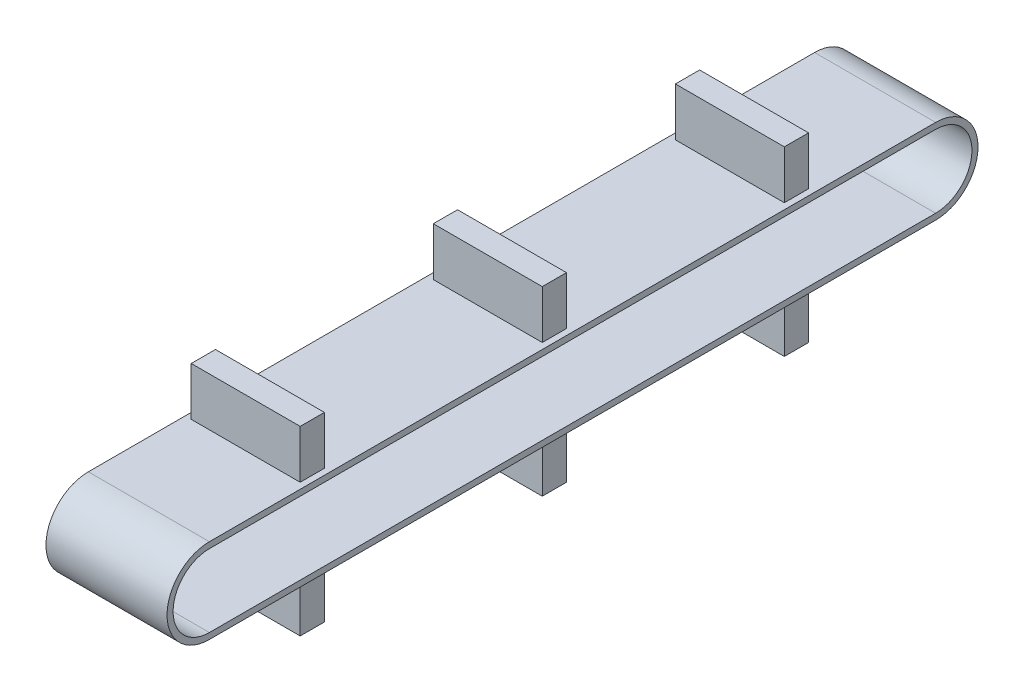
ISO-10303-21;
HEADER;
FILE_DESCRIPTION(('STEP AP214'),'2;1');
FILE_NAME('part.step','',(''),(''),'','','');
FILE_SCHEMA(('AUTOMOTIVE_DESIGN { 1 0 10303 214 1 1 1 1 }'));
ENDSEC;
DATA;
#1=APPLICATION_CONTEXT('core data for automotive mechanical design processes');
#2=APPLICATION_PROTOCOL_DEFINITION('international standard','automotive_design',2000,#1);
#3=PRODUCT_CONTEXT('',#1,'mechanical');
#4=PRODUCT('Part','Part','',(#3));
#5=PRODUCT_RELATED_PRODUCT_CATEGORY('part','',(#4));
#6=PRODUCT_DEFINITION_FORMATION('','',#4);
#7=PRODUCT_DEFINITION_CONTEXT('part definition',#1,'design');
#8=PRODUCT_DEFINITION('design','',#6,#7);
#9=PRODUCT_DEFINITION_SHAPE('','',#8);
#10=(LENGTH_UNIT() NAMED_UNIT(*) SI_UNIT(.MILLI.,.METRE.));
#11=(NAMED_UNIT(*) PLANE_ANGLE_UNIT() SI_UNIT($,.RADIAN.));
#12=(NAMED_UNIT(*) SI_UNIT($,.STERADIAN.) SOLID_ANGLE_UNIT());
#13=UNCERTAINTY_MEASURE_WITH_UNIT(LENGTH_MEASURE(1.E-05),#10,'distance_accuracy_value','');
#14=(GEOMETRIC_REPRESENTATION_CONTEXT(3) GLOBAL_UNCERTAINTY_ASSIGNED_CONTEXT((#13)) GLOBAL_UNIT_ASSIGNED_CONTEXT((#10,
#11,#12)) REPRESENTATION_CONTEXT('',''));
#15=CARTESIAN_POINT('',(0.,0.,0.));
#16=DIRECTION('',(0.,0.,1.));
#17=DIRECTION('',(1.,0.,0.));
#18=AXIS2_PLACEMENT_3D('',#15,#16,#17);
#19=CARTESIAN_POINT('',(50.,-17.5,54.1795308323915));
#20=DIRECTION('',(0.,1.,0.));
#21=DIRECTION('',(0.,0.,1.));
#22=AXIS2_PLACEMENT_3D('',#19,#20,#21);
#23=PLANE('',#22);
#24=DIRECTION('',(-1.,0.,0.));
#25=VECTOR('',#24,1.);
#26=CARTESIAN_POINT('',(2.49999999999965,-17.5,-85.8204691676085));
#27=LINE('',#26,#25);
#28=CARTESIAN_POINT('',(47.4999999999997,-17.5,-85.8204691676085));
#29=VERTEX_POINT('',#28);
#30=CARTESIAN_POINT('',(2.49999999999966,-17.5,-85.8204691676085));
#31=VERTEX_POINT('',#30);
#32=EDGE_CURVE('E273',#29,#31,#27,.T.);
#33=ORIENTED_EDGE('',*,*,#32,.F.);
#34=DIRECTION('',(0.,0.,1.));
#35=VECTOR('',#34,1.);
#36=CARTESIAN_POINT('',(47.4999999999997,-17.5,-85.8204691676085));
#37=LINE('',#36,#35);
#38=CARTESIAN_POINT('',(47.4999999999997,-17.5,-95.8204691676085));
#39=VERTEX_POINT('',#38);
#40=EDGE_CURVE('E289',#39,#29,#37,.T.);
#41=ORIENTED_EDGE('',*,*,#40,.F.);
#42=DIRECTION('',(1.,0.,0.));
#43=VECTOR('',#42,1.);
#44=CARTESIAN_POINT('',(2.49999999999965,-17.5,-95.8204691676085));
#45=LINE('',#44,#43);
#46=CARTESIAN_POINT('',(2.49999999999966,-17.5,-95.8204691676085));
#47=VERTEX_POINT('',#46);
#48=EDGE_CURVE('E302',#47,#39,#45,.T.);
#49=ORIENTED_EDGE('',*,*,#48,.F.);
#50=DIRECTION('',(0.,0.,-1.));
#51=VECTOR('',#50,1.);
#52=CARTESIAN_POINT('',(2.49999999999965,-17.5,-85.8204691676085));
#53=LINE('',#52,#51);
#54=EDGE_CURVE('E278',#31,#47,#53,.T.);
#55=ORIENTED_EDGE('',*,*,#54,.F.);
#56=EDGE_LOOP('',(#33,#41,#49,#55));
#57=FACE_BOUND('',#56,.T.);
#58=DIRECTION('',(0.,0.,-1.));
#59=VECTOR('',#58,1.);
#60=CARTESIAN_POINT('',(0.,-17.5,54.1795308323915));
#61=LINE('',#60,#59);
#62=CARTESIAN_POINT('',(0.,-17.5,54.1795308323915));
#63=VERTEX_POINT('',#62);
#64=CARTESIAN_POINT('',(0.,-17.5,-245.820469167609));
#65=VERTEX_POINT('',#64);
#66=EDGE_CURVE('E566',#63,#65,#61,.T.);
#67=ORIENTED_EDGE('',*,*,#66,.T.);
#68=DIRECTION('',(-1.,0.,0.));
#69=VECTOR('',#68,1.);
#70=CARTESIAN_POINT('',(50.,-17.5,-245.820469167609));
#71=LINE('',#70,#69);
#72=CARTESIAN_POINT('',(50.,-17.5,-245.820469167609));
#73=VERTEX_POINT('',#72);
#74=EDGE_CURVE('E48',#73,#65,#71,.T.);
#75=ORIENTED_EDGE('',*,*,#74,.F.);
#76=DIRECTION('',(0.,0.,-1.));
#77=VECTOR('',#76,1.);
#78=CARTESIAN_POINT('',(50.,-17.5,54.1795308323915));
#79=LINE('',#78,#77);
#80=CARTESIAN_POINT('',(50.,-17.5,54.1795308323915));
#81=VERTEX_POINT('',#80);
#82=EDGE_CURVE('E552',#81,#73,#79,.T.);
#83=ORIENTED_EDGE('',*,*,#82,.F.);
#84=DIRECTION('',(-1.,0.,0.));
#85=VECTOR('',#84,1.);
#86=CARTESIAN_POINT('',(50.,-17.5,54.1795308323915));
#87=LINE('',#86,#85);
#88=EDGE_CURVE('E11',#81,#63,#87,.T.);
#89=ORIENTED_EDGE('',*,*,#88,.T.);
#90=EDGE_LOOP('',(#67,#75,#83,#89));
#91=FACE_BOUND('',#90,.T.);
#92=DIRECTION('',(0.,0.,-1.));
#93=VECTOR('',#92,1.);
#94=CARTESIAN_POINT('',(2.5,-17.5,-185.820469167608));
#95=LINE('',#94,#93);
#96=CARTESIAN_POINT('',(2.5,-17.5,-185.820469167608));
#97=VERTEX_POINT('',#96);
#98=CARTESIAN_POINT('',(2.5,-17.5,-195.820469167608));
#99=VERTEX_POINT('',#98);
#100=EDGE_CURVE('E324',#97,#99,#95,.T.);
#101=ORIENTED_EDGE('',*,*,#100,.F.);
#102=DIRECTION('',(-1.,0.,0.));
#103=VECTOR('',#102,1.);
#104=CARTESIAN_POINT('',(2.5,-17.5,-185.820469167608));
#105=LINE('',#104,#103);
#106=CARTESIAN_POINT('',(47.5,-17.5,-185.820469167608));
#107=VERTEX_POINT('',#106);
#108=EDGE_CURVE('E330',#107,#97,#105,.T.);
#109=ORIENTED_EDGE('',*,*,#108,.F.);
#110=DIRECTION('',(0.,0.,1.));
#111=VECTOR('',#110,1.);
#112=CARTESIAN_POINT('',(47.5,-17.5,-185.820469167608));
#113=LINE('',#112,#111);
#114=CARTESIAN_POINT('',(47.5,-17.5,-195.820469167608));
#115=VERTEX_POINT('',#114);
#116=EDGE_CURVE('E347',#115,#107,#113,.T.);
#117=ORIENTED_EDGE('',*,*,#116,.F.);
#118=DIRECTION('',(1.,0.,0.));
#119=VECTOR('',#118,1.);
#120=CARTESIAN_POINT('',(2.5,-17.5,-195.820469167608));
#121=LINE('',#120,#119);
#122=EDGE_CURVE('E343',#99,#115,#121,.T.);
#123=ORIENTED_EDGE('',*,*,#122,.F.);
#124=EDGE_LOOP('',(#101,#109,#117,#123));
#125=FACE_BOUND('',#124,.T.);
#126=DIRECTION('',(-1.,0.,0.));
#127=VECTOR('',#126,1.);
#128=CARTESIAN_POINT('',(2.4999999999993,-17.5,14.1795308323915));
#129=LINE('',#128,#127);
#130=CARTESIAN_POINT('',(47.4999999999993,-17.5,14.1795308323915));
#131=VERTEX_POINT('',#130);
#132=CARTESIAN_POINT('',(2.4999999999993,-17.5,14.1795308323915));
#133=VERTEX_POINT('',#132);
#134=EDGE_CURVE('E271',#131,#133,#129,.T.);
#135=ORIENTED_EDGE('',*,*,#134,.F.);
#136=DIRECTION('',(0.,0.,1.));
#137=VECTOR('',#136,1.);
#138=CARTESIAN_POINT('',(47.4999999999993,-17.5,14.1795308323915));
#139=LINE('',#138,#137);
#140=CARTESIAN_POINT('',(47.4999999999993,-17.5,4.17953083239153));
#141=VERTEX_POINT('',#140);
#142=EDGE_CURVE('E268',#141,#131,#139,.T.);
#143=ORIENTED_EDGE('',*,*,#142,.F.);
#144=DIRECTION('',(1.,0.,0.));
#145=VECTOR('',#144,1.);
#146=CARTESIAN_POINT('',(2.49999999999931,-17.5,4.17953083239153));
#147=LINE('',#146,#145);
#148=CARTESIAN_POINT('',(2.49999999999931,-17.5,4.17953083239153));
#149=VERTEX_POINT('',#148);
#150=EDGE_CURVE('E60',#149,#141,#147,.T.);
#151=ORIENTED_EDGE('',*,*,#150,.F.);
#152=DIRECTION('',(0.,0.,-1.));
#153=VECTOR('',#152,1.);
#154=CARTESIAN_POINT('',(2.4999999999993,-17.5,14.1795308323915));
#155=LINE('',#154,#153);
#156=EDGE_CURVE('E55',#133,#149,#155,.T.);
#157=ORIENTED_EDGE('',*,*,#156,.F.);
#158=EDGE_LOOP('',(#135,#143,#151,#157));
#159=FACE_BOUND('',#158,.T.);
#160=ADVANCED_FACE('F39',(#57,#91,#125,#159),#23,.F.);
#161=CARTESIAN_POINT('',(50.,17.5,54.1795308323915));
#162=DIRECTION('',(0.,-1.,0.));
#163=DIRECTION('',(0.,0.,-1.));
#164=AXIS2_PLACEMENT_3D('',#161,#162,#163);
#165=PLANE('',#164);
#166=DIRECTION('',(-1.,0.,0.));
#167=VECTOR('',#166,1.);
#168=CARTESIAN_POINT('',(2.50000000000105,17.5,-95.8204691676084));
#169=LINE('',#168,#167);
#170=CARTESIAN_POINT('',(47.5000000000011,17.5,-95.8204691676085));
#171=VERTEX_POINT('',#170);
#172=CARTESIAN_POINT('',(2.50000000000105,17.5,-95.8204691676084));
#173=VERTEX_POINT('',#172);
#174=EDGE_CURVE('E414',#171,#173,#169,.T.);
#175=ORIENTED_EDGE('',*,*,#174,.F.);
#176=DIRECTION('',(0.,0.,-1.));
#177=VECTOR('',#176,1.);
#178=CARTESIAN_POINT('',(47.5000000000011,17.5,-95.8204691676085));
#179=LINE('',#178,#177);
#180=CARTESIAN_POINT('',(47.5000000000011,17.5,-85.8204691676085));
#181=VERTEX_POINT('',#180);
#182=EDGE_CURVE('E420',#181,#171,#179,.T.);
#183=ORIENTED_EDGE('',*,*,#182,.F.);
#184=DIRECTION('',(1.,0.,0.));
#185=VECTOR('',#184,1.);
#186=CARTESIAN_POINT('',(2.50000000000105,17.5,-85.8204691676084));
#187=LINE('',#186,#185);
#188=CARTESIAN_POINT('',(2.50000000000105,17.5,-85.8204691676084));
#189=VERTEX_POINT('',#188);
#190=EDGE_CURVE('E437',#189,#181,#187,.T.);
#191=ORIENTED_EDGE('',*,*,#190,.F.);
#192=DIRECTION('',(0.,0.,1.));
#193=VECTOR('',#192,1.);
#194=CARTESIAN_POINT('',(2.50000000000105,17.5,-95.8204691676084));
#195=LINE('',#194,#193);
#196=EDGE_CURVE('E433',#173,#189,#195,.T.);
#197=ORIENTED_EDGE('',*,*,#196,.F.);
#198=EDGE_LOOP('',(#175,#183,#191,#197));
#199=FACE_BOUND('',#198,.T.);
#200=DIRECTION('',(0.,0.,1.));
#201=VECTOR('',#200,1.);
#202=CARTESIAN_POINT('',(0.,17.5,54.1795308323915));
#203=LINE('',#202,#201);
#204=CARTESIAN_POINT('',(0.,17.5,-245.820469167609));
#205=VERTEX_POINT('',#204);
#206=CARTESIAN_POINT('',(0.,17.5,54.1795308323915));
#207=VERTEX_POINT('',#206);
#208=EDGE_CURVE('E553',#205,#207,#203,.T.);
#209=ORIENTED_EDGE('',*,*,#208,.T.);
#210=DIRECTION('',(-1.,0.,0.));
#211=VECTOR('',#210,1.);
#212=CARTESIAN_POINT('',(50.,17.5,54.1795308323915));
#213=LINE('',#212,#211);
#214=CARTESIAN_POINT('',(50.,17.5,54.1795308323915));
#215=VERTEX_POINT('',#214);
#216=EDGE_CURVE('E562',#215,#207,#213,.T.);
#217=ORIENTED_EDGE('',*,*,#216,.F.);
#218=DIRECTION('',(0.,0.,1.));
#219=VECTOR('',#218,1.);
#220=CARTESIAN_POINT('',(50.,17.5,54.1795308323915));
#221=LINE('',#220,#219);
#222=CARTESIAN_POINT('',(50.,17.5,-245.820469167609));
#223=VERTEX_POINT('',#222);
#224=EDGE_CURVE('E559',#223,#215,#221,.T.);
#225=ORIENTED_EDGE('',*,*,#224,.F.);
#226=DIRECTION('',(-1.,0.,0.));
#227=VECTOR('',#226,1.);
#228=CARTESIAN_POINT('',(50.,17.5,-245.820469167609));
#229=LINE('',#228,#227);
#230=EDGE_CURVE('E577',#223,#205,#229,.T.);
#231=ORIENTED_EDGE('',*,*,#230,.T.);
#232=EDGE_LOOP('',(#209,#217,#225,#231));
#233=FACE_BOUND('',#232,.T.);
#234=DIRECTION('',(0.,0.,1.));
#235=VECTOR('',#234,1.);
#236=CARTESIAN_POINT('',(2.5,17.5,-195.820469167608));
#237=LINE('',#236,#235);
#238=CARTESIAN_POINT('',(2.5,17.5,-195.820469167608));
#239=VERTEX_POINT('',#238);
#240=CARTESIAN_POINT('',(2.5,17.5,-185.820469167608));
#241=VERTEX_POINT('',#240);
#242=EDGE_CURVE('E459',#239,#241,#237,.T.);
#243=ORIENTED_EDGE('',*,*,#242,.F.);
#244=DIRECTION('',(-1.,0.,0.));
#245=VECTOR('',#244,1.);
#246=CARTESIAN_POINT('',(2.5,17.5,-195.820469167608));
#247=LINE('',#246,#245);
#248=CARTESIAN_POINT('',(47.5,17.5,-195.820469167608));
#249=VERTEX_POINT('',#248);
#250=EDGE_CURVE('E465',#249,#239,#247,.T.);
#251=ORIENTED_EDGE('',*,*,#250,.F.);
#252=DIRECTION('',(0.,0.,-1.));
#253=VECTOR('',#252,1.);
#254=CARTESIAN_POINT('',(47.5,17.5,-195.820469167608));
#255=LINE('',#254,#253);
#256=CARTESIAN_POINT('',(47.5,17.5,-185.820469167608));
#257=VERTEX_POINT('',#256);
#258=EDGE_CURVE('E482',#257,#249,#255,.T.);
#259=ORIENTED_EDGE('',*,*,#258,.F.);
#260=DIRECTION('',(1.,0.,0.));
#261=VECTOR('',#260,1.);
#262=CARTESIAN_POINT('',(2.5,17.5,-185.820469167608));
#263=LINE('',#262,#261);
#264=EDGE_CURVE('E478',#241,#257,#263,.T.);
#265=ORIENTED_EDGE('',*,*,#264,.F.);
#266=EDGE_LOOP('',(#243,#251,#259,#265));
#267=FACE_BOUND('',#266,.T.);
#268=DIRECTION('',(-1.,0.,0.));
#269=VECTOR('',#268,1.);
#270=CARTESIAN_POINT('',(2.50000000000209,17.5,4.17953083239159));
#271=LINE('',#270,#269);
#272=CARTESIAN_POINT('',(47.5000000000021,17.5,4.17953083239153));
#273=VERTEX_POINT('',#272);
#274=CARTESIAN_POINT('',(2.5000000000021,17.5,4.17953083239159));
#275=VERTEX_POINT('',#274);
#276=EDGE_CURVE('E369',#273,#275,#271,.T.);
#277=ORIENTED_EDGE('',*,*,#276,.F.);
#278=DIRECTION('',(0.,0.,-1.));
#279=VECTOR('',#278,1.);
#280=CARTESIAN_POINT('',(47.5000000000021,17.5,4.17953083239153));
#281=LINE('',#280,#279);
#282=CARTESIAN_POINT('',(47.5000000000021,17.5,14.1795308323915));
#283=VERTEX_POINT('',#282);
#284=EDGE_CURVE('E375',#283,#273,#281,.T.);
#285=ORIENTED_EDGE('',*,*,#284,.F.);
#286=DIRECTION('',(1.,0.,0.));
#287=VECTOR('',#286,1.);
#288=CARTESIAN_POINT('',(2.5000000000021,17.5,14.1795308323916));
#289=LINE('',#288,#287);
#290=CARTESIAN_POINT('',(2.5000000000021,17.5,14.1795308323916));
#291=VERTEX_POINT('',#290);
#292=EDGE_CURVE('E392',#291,#283,#289,.T.);
#293=ORIENTED_EDGE('',*,*,#292,.F.);
#294=DIRECTION('',(0.,0.,1.));
#295=VECTOR('',#294,1.);
#296=CARTESIAN_POINT('',(2.50000000000209,17.5,4.17953083239159));
#297=LINE('',#296,#295);
#298=EDGE_CURVE('E388',#275,#291,#297,.T.);
#299=ORIENTED_EDGE('',*,*,#298,.F.);
#300=EDGE_LOOP('',(#277,#285,#293,#299));
#301=FACE_BOUND('',#300,.T.);
#302=ADVANCED_FACE('F596',(#199,#233,#267,#301),#165,.F.);
#303=CARTESIAN_POINT('',(50.,0.,54.1795308323915));
#304=DIRECTION('',(1.,0.,0.));
#305=DIRECTION('',(0.,0.,-1.));
#306=AXIS2_PLACEMENT_3D('',#303,#304,#305);
#307=PLANE('',#306);
#308=CARTESIAN_POINT('',(50.,0.,54.1795308323915));
#309=DIRECTION('',(1.,0.,0.));
#310=DIRECTION('',(0.,0.,-1.));
#311=AXIS2_PLACEMENT_3D('',#308,#309,#310);
#312=CIRCLE('',#311,17.5);
#313=EDGE_CURVE('E548',#215,#81,#312,.T.);
#314=ORIENTED_EDGE('',*,*,#313,.T.);
#315=ORIENTED_EDGE('',*,*,#82,.T.);
#316=CARTESIAN_POINT('',(50.,0.,-245.820469167609));
#317=DIRECTION('',(1.,0.,0.));
#318=DIRECTION('',(0.,0.,-1.));
#319=AXIS2_PLACEMENT_3D('',#316,#317,#318);
#320=CIRCLE('',#319,17.5);
#321=EDGE_CURVE('E556',#73,#223,#320,.T.);
#322=ORIENTED_EDGE('',*,*,#321,.T.);
#323=ORIENTED_EDGE('',*,*,#224,.T.);
#324=EDGE_LOOP('',(#314,#315,#322,#323));
#325=FACE_BOUND('',#324,.T.);
#326=DIRECTION('',(0.,0.,-1.));
#327=VECTOR('',#326,1.);
#328=CARTESIAN_POINT('',(50.,-15.,54.1795308323915));
#329=LINE('',#328,#327);
#330=CARTESIAN_POINT('',(50.,-15.,54.1795308323915));
#331=VERTEX_POINT('',#330);
#332=CARTESIAN_POINT('',(50.,-15.,-245.820469167609));
#333=VERTEX_POINT('',#332);
#334=EDGE_CURVE('E508',#331,#333,#329,.T.);
#335=ORIENTED_EDGE('',*,*,#334,.F.);
#336=CARTESIAN_POINT('',(50.,0.,54.1795308323915));
#337=DIRECTION('',(1.,0.,0.));
#338=DIRECTION('',(0.,0.,-1.));
#339=AXIS2_PLACEMENT_3D('',#336,#337,#338);
#340=CIRCLE('',#339,15.);
#341=CARTESIAN_POINT('',(50.,15.,54.1795308323915));
#342=VERTEX_POINT('',#341);
#343=EDGE_CURVE('E505',#342,#331,#340,.T.);
#344=ORIENTED_EDGE('',*,*,#343,.F.);
#345=DIRECTION('',(0.,0.,1.));
#346=VECTOR('',#345,1.);
#347=CARTESIAN_POINT('',(50.,15.,54.1795308323915));
#348=LINE('',#347,#346);
#349=CARTESIAN_POINT('',(50.,15.,-245.820469167609));
#350=VERTEX_POINT('',#349);
#351=EDGE_CURVE('E516',#350,#342,#348,.T.);
#352=ORIENTED_EDGE('',*,*,#351,.F.);
#353=CARTESIAN_POINT('',(50.,0.,-245.820469167609));
#354=DIRECTION('',(1.,0.,0.));
#355=DIRECTION('',(0.,0.,-1.));
#356=AXIS2_PLACEMENT_3D('',#353,#354,#355);
#357=CIRCLE('',#356,15.);
#358=EDGE_CURVE('E512',#333,#350,#357,.T.);
#359=ORIENTED_EDGE('',*,*,#358,.F.);
#360=EDGE_LOOP('',(#335,#344,#352,#359));
#361=FACE_BOUND('',#360,.T.);
#362=ADVANCED_FACE('F603',(#325,#361),#307,.T.);
#363=CARTESIAN_POINT('',(0.,0.,54.1795308323915));
#364=DIRECTION('',(1.,0.,0.));
#365=DIRECTION('',(0.,0.,-1.));
#366=AXIS2_PLACEMENT_3D('',#363,#364,#365);
#367=PLANE('',#366);
#368=CARTESIAN_POINT('',(0.,0.,54.1795308323915));
#369=DIRECTION('',(1.,0.,0.));
#370=DIRECTION('',(0.,0.,-1.));
#371=AXIS2_PLACEMENT_3D('',#368,#369,#370);
#372=CIRCLE('',#371,17.5);
#373=EDGE_CURVE('E547',#207,#63,#372,.T.);
#374=ORIENTED_EDGE('',*,*,#373,.F.);
#375=ORIENTED_EDGE('',*,*,#208,.F.);
#376=CARTESIAN_POINT('',(0.,0.,-245.820469167609));
#377=DIRECTION('',(1.,0.,0.));
#378=DIRECTION('',(0.,0.,-1.));
#379=AXIS2_PLACEMENT_3D('',#376,#377,#378);
#380=CIRCLE('',#379,17.5);
#381=EDGE_CURVE('E569',#65,#205,#380,.T.);
#382=ORIENTED_EDGE('',*,*,#381,.F.);
#383=ORIENTED_EDGE('',*,*,#66,.F.);
#384=EDGE_LOOP('',(#374,#375,#382,#383));
#385=FACE_BOUND('',#384,.T.);
#386=CARTESIAN_POINT('',(0.,0.,54.1795308323915));
#387=DIRECTION('',(1.,0.,0.));
#388=DIRECTION('',(0.,0.,-1.));
#389=AXIS2_PLACEMENT_3D('',#386,#387,#388);
#390=CIRCLE('',#389,15.);
#391=CARTESIAN_POINT('',(0.,15.,54.1795308323915));
#392=VERTEX_POINT('',#391);
#393=CARTESIAN_POINT('',(0.,-15.,54.1795308323915));
#394=VERTEX_POINT('',#393);
#395=EDGE_CURVE('E504',#392,#394,#390,.T.);
#396=ORIENTED_EDGE('',*,*,#395,.T.);
#397=DIRECTION('',(0.,0.,-1.));
#398=VECTOR('',#397,1.);
#399=CARTESIAN_POINT('',(0.,-15.,54.1795308323915));
#400=LINE('',#399,#398);
#401=CARTESIAN_POINT('',(0.,-15.,-245.820469167609));
#402=VERTEX_POINT('',#401);
#403=EDGE_CURVE('E523',#394,#402,#400,.T.);
#404=ORIENTED_EDGE('',*,*,#403,.T.);
#405=CARTESIAN_POINT('',(0.,0.,-245.820469167609));
#406=DIRECTION('',(1.,0.,0.));
#407=DIRECTION('',(0.,0.,-1.));
#408=AXIS2_PLACEMENT_3D('',#405,#406,#407);
#409=CIRCLE('',#408,15.);
#410=CARTESIAN_POINT('',(0.,15.,-245.820469167609));
#411=VERTEX_POINT('',#410);
#412=EDGE_CURVE('E527',#402,#411,#409,.T.);
#413=ORIENTED_EDGE('',*,*,#412,.T.);
#414=DIRECTION('',(0.,0.,1.));
#415=VECTOR('',#414,1.);
#416=CARTESIAN_POINT('',(0.,15.,54.1795308323915));
#417=LINE('',#416,#415);
#418=EDGE_CURVE('E509',#411,#392,#417,.T.);
#419=ORIENTED_EDGE('',*,*,#418,.T.);
#420=EDGE_LOOP('',(#396,#404,#413,#419));
#421=FACE_BOUND('',#420,.T.);
#422=ADVANCED_FACE('F592',(#385,#421),#367,.F.);
#423=CARTESIAN_POINT('',(50.,0.,54.1795308323915));
#424=DIRECTION('',(-1.,0.,0.));
#425=DIRECTION('',(0.,0.,1.));
#426=AXIS2_PLACEMENT_3D('',#423,#424,#425);
#427=CYLINDRICAL_SURFACE('',#426,17.5);
#428=ORIENTED_EDGE('',*,*,#373,.T.);
#429=ORIENTED_EDGE('',*,*,#88,.F.);
#430=ORIENTED_EDGE('',*,*,#313,.F.);
#431=ORIENTED_EDGE('',*,*,#216,.T.);
#432=EDGE_LOOP('',(#428,#429,#430,#431));
#433=FACE_BOUND('',#432,.T.);
#434=ADVANCED_FACE('F41',(#433),#427,.T.);
#435=CARTESIAN_POINT('',(50.,0.,-245.820469167609));
#436=DIRECTION('',(-1.,0.,0.));
#437=DIRECTION('',(0.,0.,1.));
#438=AXIS2_PLACEMENT_3D('',#435,#436,#437);
#439=CYLINDRICAL_SURFACE('',#438,17.5);
#440=ORIENTED_EDGE('',*,*,#381,.T.);
#441=ORIENTED_EDGE('',*,*,#230,.F.);
#442=ORIENTED_EDGE('',*,*,#321,.F.);
#443=ORIENTED_EDGE('',*,*,#74,.T.);
#444=EDGE_LOOP('',(#440,#441,#442,#443));
#445=FACE_BOUND('',#444,.T.);
#446=ADVANCED_FACE('F586',(#445),#439,.T.);
#447=CARTESIAN_POINT('',(50.,0.,54.1795308323915));
#448=DIRECTION('',(-1.,0.,0.));
#449=DIRECTION('',(0.,0.,1.));
#450=AXIS2_PLACEMENT_3D('',#447,#448,#449);
#451=CYLINDRICAL_SURFACE('',#450,15.);
#452=ORIENTED_EDGE('',*,*,#395,.F.);
#453=DIRECTION('',(-1.,0.,0.));
#454=VECTOR('',#453,1.);
#455=CARTESIAN_POINT('',(50.,15.,54.1795308323915));
#456=LINE('',#455,#454);
#457=EDGE_CURVE('E519',#342,#392,#456,.T.);
#458=ORIENTED_EDGE('',*,*,#457,.F.);
#459=ORIENTED_EDGE('',*,*,#343,.T.);
#460=DIRECTION('',(-1.,0.,0.));
#461=VECTOR('',#460,1.);
#462=CARTESIAN_POINT('',(50.,-15.,54.1795308323915));
#463=LINE('',#462,#461);
#464=EDGE_CURVE('E543',#331,#394,#463,.T.);
#465=ORIENTED_EDGE('',*,*,#464,.T.);
#466=EDGE_LOOP('',(#452,#458,#459,#465));
#467=FACE_BOUND('',#466,.T.);
#468=ADVANCED_FACE('F754',(#467),#451,.F.);
#469=CARTESIAN_POINT('',(50.,-15.,54.1795308323915));
#470=DIRECTION('',(0.,1.,0.));
#471=DIRECTION('',(0.,0.,1.));
#472=AXIS2_PLACEMENT_3D('',#469,#470,#471);
#473=PLANE('',#472);
#474=ORIENTED_EDGE('',*,*,#403,.F.);
#475=ORIENTED_EDGE('',*,*,#464,.F.);
#476=ORIENTED_EDGE('',*,*,#334,.T.);
#477=DIRECTION('',(-1.,0.,0.));
#478=VECTOR('',#477,1.);
#479=CARTESIAN_POINT('',(50.,-15.,-245.820469167609));
#480=LINE('',#479,#478);
#481=EDGE_CURVE('E540',#333,#402,#480,.T.);
#482=ORIENTED_EDGE('',*,*,#481,.T.);
#483=EDGE_LOOP('',(#474,#475,#476,#482));
#484=FACE_BOUND('',#483,.T.);
#485=ADVANCED_FACE('F750',(#484),#473,.T.);
#486=CARTESIAN_POINT('',(50.,0.,-245.820469167609));
#487=DIRECTION('',(-1.,0.,0.));
#488=DIRECTION('',(0.,0.,1.));
#489=AXIS2_PLACEMENT_3D('',#486,#487,#488);
#490=CYLINDRICAL_SURFACE('',#489,15.);
#491=ORIENTED_EDGE('',*,*,#412,.F.);
#492=ORIENTED_EDGE('',*,*,#481,.F.);
#493=ORIENTED_EDGE('',*,*,#358,.T.);
#494=DIRECTION('',(-1.,0.,0.));
#495=VECTOR('',#494,1.);
#496=CARTESIAN_POINT('',(50.,15.,-245.820469167609));
#497=LINE('',#496,#495);
#498=EDGE_CURVE('E537',#350,#411,#497,.T.);
#499=ORIENTED_EDGE('',*,*,#498,.T.);
#500=EDGE_LOOP('',(#491,#492,#493,#499));
#501=FACE_BOUND('',#500,.T.);
#502=ADVANCED_FACE('F746',(#501),#490,.F.);
#503=CARTESIAN_POINT('',(50.,15.,54.1795308323915));
#504=DIRECTION('',(0.,-1.,0.));
#505=DIRECTION('',(0.,0.,-1.));
#506=AXIS2_PLACEMENT_3D('',#503,#504,#505);
#507=PLANE('',#506);
#508=ORIENTED_EDGE('',*,*,#418,.F.);
#509=ORIENTED_EDGE('',*,*,#498,.F.);
#510=ORIENTED_EDGE('',*,*,#351,.T.);
#511=ORIENTED_EDGE('',*,*,#457,.T.);
#512=EDGE_LOOP('',(#508,#509,#510,#511));
#513=FACE_BOUND('',#512,.T.);
#514=ADVANCED_FACE('F742',(#513),#507,.T.);
#515=CARTESIAN_POINT('',(2.5,37.5,-195.820469167608));
#516=DIRECTION('',(1.,0.,0.));
#517=DIRECTION('',(0.,0.,-1.));
#518=AXIS2_PLACEMENT_3D('',#515,#516,#517);
#519=PLANE('',#518);
#520=ORIENTED_EDGE('',*,*,#242,.T.);
#521=DIRECTION('',(0.,-1.,0.));
#522=VECTOR('',#521,1.);
#523=CARTESIAN_POINT('',(2.5,37.5,-185.820469167608));
#524=LINE('',#523,#522);
#525=CARTESIAN_POINT('',(2.5,37.5,-185.820469167608));
#526=VERTEX_POINT('',#525);
#527=EDGE_CURVE('E500',#526,#241,#524,.T.);
#528=ORIENTED_EDGE('',*,*,#527,.F.);
#529=DIRECTION('',(0.,0.,1.));
#530=VECTOR('',#529,1.);
#531=CARTESIAN_POINT('',(2.5,37.5,-195.820469167608));
#532=LINE('',#531,#530);
#533=CARTESIAN_POINT('',(2.5,37.5,-195.820469167608));
#534=VERTEX_POINT('',#533);
#535=EDGE_CURVE('E460',#534,#526,#532,.T.);
#536=ORIENTED_EDGE('',*,*,#535,.F.);
#537=DIRECTION('',(0.,-1.,0.));
#538=VECTOR('',#537,1.);
#539=CARTESIAN_POINT('',(2.5,37.5,-195.820469167608));
#540=LINE('',#539,#538);
#541=EDGE_CURVE('E474',#534,#239,#540,.T.);
#542=ORIENTED_EDGE('',*,*,#541,.T.);
#543=EDGE_LOOP('',(#520,#528,#536,#542));
#544=FACE_BOUND('',#543,.T.);
#545=ADVANCED_FACE('F738',(#544),#519,.F.);
#546=CARTESIAN_POINT('',(2.5,37.5,-185.820469167608));
#547=DIRECTION('',(0.,0.,-1.));
#548=DIRECTION('',(-1.,0.,0.));
#549=AXIS2_PLACEMENT_3D('',#546,#547,#548);
#550=PLANE('',#549);
#551=ORIENTED_EDGE('',*,*,#264,.T.);
#552=DIRECTION('',(0.,-1.,0.));
#553=VECTOR('',#552,1.);
#554=CARTESIAN_POINT('',(47.5,37.5,-185.820469167608));
#555=LINE('',#554,#553);
#556=CARTESIAN_POINT('',(47.5,37.5,-185.820469167608));
#557=VERTEX_POINT('',#556);
#558=EDGE_CURVE('E496',#557,#257,#555,.T.);
#559=ORIENTED_EDGE('',*,*,#558,.F.);
#560=DIRECTION('',(1.,0.,0.));
#561=VECTOR('',#560,1.);
#562=CARTESIAN_POINT('',(2.5,37.5,-185.820469167608));
#563=LINE('',#562,#561);
#564=EDGE_CURVE('E464',#526,#557,#563,.T.);
#565=ORIENTED_EDGE('',*,*,#564,.F.);
#566=ORIENTED_EDGE('',*,*,#527,.T.);
#567=EDGE_LOOP('',(#551,#559,#565,#566));
#568=FACE_BOUND('',#567,.T.);
#569=ADVANCED_FACE('F734',(#568),#550,.F.);
#570=CARTESIAN_POINT('',(47.5,37.5,-195.820469167608));
#571=DIRECTION('',(-1.,0.,0.));
#572=DIRECTION('',(0.,0.,1.));
#573=AXIS2_PLACEMENT_3D('',#570,#571,#572);
#574=PLANE('',#573);
#575=ORIENTED_EDGE('',*,*,#258,.T.);
#576=DIRECTION('',(0.,-1.,0.));
#577=VECTOR('',#576,1.);
#578=CARTESIAN_POINT('',(47.5,37.5,-195.820469167608));
#579=LINE('',#578,#577);
#580=CARTESIAN_POINT('',(47.5,37.5,-195.820469167608));
#581=VERTEX_POINT('',#580);
#582=EDGE_CURVE('E492',#581,#249,#579,.T.);
#583=ORIENTED_EDGE('',*,*,#582,.F.);
#584=DIRECTION('',(0.,0.,-1.));
#585=VECTOR('',#584,1.);
#586=CARTESIAN_POINT('',(47.5,37.5,-195.820469167608));
#587=LINE('',#586,#585);
#588=EDGE_CURVE('E468',#557,#581,#587,.T.);
#589=ORIENTED_EDGE('',*,*,#588,.F.);
#590=ORIENTED_EDGE('',*,*,#558,.T.);
#591=EDGE_LOOP('',(#575,#583,#589,#590));
#592=FACE_BOUND('',#591,.T.);
#593=ADVANCED_FACE('F730',(#592),#574,.F.);
#594=CARTESIAN_POINT('',(2.5,37.5,-195.820469167608));
#595=DIRECTION('',(0.,0.,1.));
#596=DIRECTION('',(1.,0.,0.));
#597=AXIS2_PLACEMENT_3D('',#594,#595,#596);
#598=PLANE('',#597);
#599=ORIENTED_EDGE('',*,*,#250,.T.);
#600=ORIENTED_EDGE('',*,*,#541,.F.);
#601=DIRECTION('',(-1.,0.,0.));
#602=VECTOR('',#601,1.);
#603=CARTESIAN_POINT('',(2.5,37.5,-195.820469167608));
#604=LINE('',#603,#602);
#605=EDGE_CURVE('E471',#581,#534,#604,.T.);
#606=ORIENTED_EDGE('',*,*,#605,.F.);
#607=ORIENTED_EDGE('',*,*,#582,.T.);
#608=EDGE_LOOP('',(#599,#600,#606,#607));
#609=FACE_BOUND('',#608,.T.);
#610=ADVANCED_FACE('F726',(#609),#598,.F.);
#611=CARTESIAN_POINT('',(0.,37.5,0.));
#612=DIRECTION('',(0.,1.,0.));
#613=DIRECTION('',(0.,0.,1.));
#614=AXIS2_PLACEMENT_3D('',#611,#612,#613);
#615=PLANE('',#614);
#616=ORIENTED_EDGE('',*,*,#535,.T.);
#617=ORIENTED_EDGE('',*,*,#564,.T.);
#618=ORIENTED_EDGE('',*,*,#588,.T.);
#619=ORIENTED_EDGE('',*,*,#605,.T.);
#620=EDGE_LOOP('',(#616,#617,#618,#619));
#621=FACE_BOUND('',#620,.T.);
#622=ADVANCED_FACE('F722',(#621),#615,.T.);
#623=CARTESIAN_POINT('',(2.50000000000105,37.5,-95.8204691676084));
#624=DIRECTION('',(0.,0.,1.));
#625=DIRECTION('',(1.,0.,0.));
#626=AXIS2_PLACEMENT_3D('',#623,#624,#625);
#627=PLANE('',#626);
#628=ORIENTED_EDGE('',*,*,#174,.T.);
#629=DIRECTION('',(0.,-1.,0.));
#630=VECTOR('',#629,1.);
#631=CARTESIAN_POINT('',(2.50000000000105,37.5,-95.8204691676084));
#632=LINE('',#631,#630);
#633=CARTESIAN_POINT('',(2.50000000000105,37.5,-95.8204691676084));
#634=VERTEX_POINT('',#633);
#635=EDGE_CURVE('E455',#634,#173,#632,.T.);
#636=ORIENTED_EDGE('',*,*,#635,.F.);
#637=DIRECTION('',(-1.,0.,0.));
#638=VECTOR('',#637,1.);
#639=CARTESIAN_POINT('',(2.50000000000105,37.5,-95.8204691676084));
#640=LINE('',#639,#638);
#641=CARTESIAN_POINT('',(47.5000000000011,37.5,-95.8204691676085));
#642=VERTEX_POINT('',#641);
#643=EDGE_CURVE('E415',#642,#634,#640,.T.);
#644=ORIENTED_EDGE('',*,*,#643,.F.);
#645=DIRECTION('',(0.,-1.,0.));
#646=VECTOR('',#645,1.);
#647=CARTESIAN_POINT('',(47.5000000000011,37.5,-95.8204691676085));
#648=LINE('',#647,#646);
#649=EDGE_CURVE('E429',#642,#171,#648,.T.);
#650=ORIENTED_EDGE('',*,*,#649,.T.);
#651=EDGE_LOOP('',(#628,#636,#644,#650));
#652=FACE_BOUND('',#651,.T.);
#653=ADVANCED_FACE('F718',(#652),#627,.F.);
#654=CARTESIAN_POINT('',(2.50000000000105,37.5,-95.8204691676084));
#655=DIRECTION('',(1.,0.,0.));
#656=DIRECTION('',(0.,0.,-1.));
#657=AXIS2_PLACEMENT_3D('',#654,#655,#656);
#658=PLANE('',#657);
#659=ORIENTED_EDGE('',*,*,#196,.T.);
#660=DIRECTION('',(0.,-1.,0.));
#661=VECTOR('',#660,1.);
#662=CARTESIAN_POINT('',(2.50000000000105,37.5,-85.8204691676084));
#663=LINE('',#662,#661);
#664=CARTESIAN_POINT('',(2.50000000000105,37.5,-85.8204691676084));
#665=VERTEX_POINT('',#664);
#666=EDGE_CURVE('E451',#665,#189,#663,.T.);
#667=ORIENTED_EDGE('',*,*,#666,.F.);
#668=DIRECTION('',(0.,0.,1.));
#669=VECTOR('',#668,1.);
#670=CARTESIAN_POINT('',(2.50000000000105,37.5,-95.8204691676084));
#671=LINE('',#670,#669);
#672=EDGE_CURVE('E419',#634,#665,#671,.T.);
#673=ORIENTED_EDGE('',*,*,#672,.F.);
#674=ORIENTED_EDGE('',*,*,#635,.T.);
#675=EDGE_LOOP('',(#659,#667,#673,#674));
#676=FACE_BOUND('',#675,.T.);
#677=ADVANCED_FACE('F714',(#676),#658,.F.);
#678=CARTESIAN_POINT('',(2.50000000000105,37.5,-85.8204691676084));
#679=DIRECTION('',(0.,0.,-1.));
#680=DIRECTION('',(-1.,0.,0.));
#681=AXIS2_PLACEMENT_3D('',#678,#679,#680);
#682=PLANE('',#681);
#683=ORIENTED_EDGE('',*,*,#190,.T.);
#684=DIRECTION('',(0.,-1.,0.));
#685=VECTOR('',#684,1.);
#686=CARTESIAN_POINT('',(47.5000000000011,37.5,-85.8204691676085));
#687=LINE('',#686,#685);
#688=CARTESIAN_POINT('',(47.5000000000011,37.5,-85.8204691676085));
#689=VERTEX_POINT('',#688);
#690=EDGE_CURVE('E447',#689,#181,#687,.T.);
#691=ORIENTED_EDGE('',*,*,#690,.F.);
#692=DIRECTION('',(1.,0.,0.));
#693=VECTOR('',#692,1.);
#694=CARTESIAN_POINT('',(2.50000000000105,37.5,-85.8204691676084));
#695=LINE('',#694,#693);
#696=EDGE_CURVE('E423',#665,#689,#695,.T.);
#697=ORIENTED_EDGE('',*,*,#696,.F.);
#698=ORIENTED_EDGE('',*,*,#666,.T.);
#699=EDGE_LOOP('',(#683,#691,#697,#698));
#700=FACE_BOUND('',#699,.T.);
#701=ADVANCED_FACE('F710',(#700),#682,.F.);
#702=CARTESIAN_POINT('',(47.5000000000011,37.5,-95.8204691676085));
#703=DIRECTION('',(-1.,0.,0.));
#704=DIRECTION('',(0.,0.,1.));
#705=AXIS2_PLACEMENT_3D('',#702,#703,#704);
#706=PLANE('',#705);
#707=ORIENTED_EDGE('',*,*,#182,.T.);
#708=ORIENTED_EDGE('',*,*,#649,.F.);
#709=DIRECTION('',(0.,0.,-1.));
#710=VECTOR('',#709,1.);
#711=CARTESIAN_POINT('',(47.5000000000011,37.5,-95.8204691676085));
#712=LINE('',#711,#710);
#713=EDGE_CURVE('E426',#689,#642,#712,.T.);
#714=ORIENTED_EDGE('',*,*,#713,.F.);
#715=ORIENTED_EDGE('',*,*,#690,.T.);
#716=EDGE_LOOP('',(#707,#708,#714,#715));
#717=FACE_BOUND('',#716,.T.);
#718=ADVANCED_FACE('F706',(#717),#706,.F.);
#719=CARTESIAN_POINT('',(0.,37.5,0.));
#720=DIRECTION('',(0.,-1.,0.));
#721=DIRECTION('',(0.,0.,-1.));
#722=AXIS2_PLACEMENT_3D('',#719,#720,#721);
#723=PLANE('',#722);
#724=ORIENTED_EDGE('',*,*,#643,.T.);
#725=ORIENTED_EDGE('',*,*,#672,.T.);
#726=ORIENTED_EDGE('',*,*,#696,.T.);
#727=ORIENTED_EDGE('',*,*,#713,.T.);
#728=EDGE_LOOP('',(#724,#725,#726,#727));
#729=FACE_BOUND('',#728,.T.);
#730=ADVANCED_FACE('F702',(#729),#723,.F.);
#731=CARTESIAN_POINT('',(2.50000000000209,37.5,4.17953083239159));
#732=DIRECTION('',(0.,0.,1.));
#733=DIRECTION('',(1.,0.,0.));
#734=AXIS2_PLACEMENT_3D('',#731,#732,#733);
#735=PLANE('',#734);
#736=ORIENTED_EDGE('',*,*,#276,.T.);
#737=DIRECTION('',(0.,-1.,0.));
#738=VECTOR('',#737,1.);
#739=CARTESIAN_POINT('',(2.50000000000209,37.5,4.17953083239159));
#740=LINE('',#739,#738);
#741=CARTESIAN_POINT('',(2.50000000000209,37.5,4.17953083239159));
#742=VERTEX_POINT('',#741);
#743=EDGE_CURVE('E410',#742,#275,#740,.T.);
#744=ORIENTED_EDGE('',*,*,#743,.F.);
#745=DIRECTION('',(-1.,0.,0.));
#746=VECTOR('',#745,1.);
#747=CARTESIAN_POINT('',(2.50000000000209,37.5,4.17953083239159));
#748=LINE('',#747,#746);
#749=CARTESIAN_POINT('',(47.5000000000021,37.5,4.17953083239153));
#750=VERTEX_POINT('',#749);
#751=EDGE_CURVE('E370',#750,#742,#748,.T.);
#752=ORIENTED_EDGE('',*,*,#751,.F.);
#753=DIRECTION('',(0.,-1.,0.));
#754=VECTOR('',#753,1.);
#755=CARTESIAN_POINT('',(47.5000000000021,37.5,4.17953083239153));
#756=LINE('',#755,#754);
#757=EDGE_CURVE('E384',#750,#273,#756,.T.);
#758=ORIENTED_EDGE('',*,*,#757,.T.);
#759=EDGE_LOOP('',(#736,#744,#752,#758));
#760=FACE_BOUND('',#759,.T.);
#761=ADVANCED_FACE('F698',(#760),#735,.F.);
#762=CARTESIAN_POINT('',(2.50000000000209,37.5,4.17953083239159));
#763=DIRECTION('',(1.,0.,0.));
#764=DIRECTION('',(0.,0.,-1.));
#765=AXIS2_PLACEMENT_3D('',#762,#763,#764);
#766=PLANE('',#765);
#767=ORIENTED_EDGE('',*,*,#298,.T.);
#768=DIRECTION('',(0.,-1.,0.));
#769=VECTOR('',#768,1.);
#770=CARTESIAN_POINT('',(2.5000000000021,37.5,14.1795308323916));
#771=LINE('',#770,#769);
#772=CARTESIAN_POINT('',(2.5000000000021,37.5,14.1795308323916));
#773=VERTEX_POINT('',#772);
#774=EDGE_CURVE('E406',#773,#291,#771,.T.);
#775=ORIENTED_EDGE('',*,*,#774,.F.);
#776=DIRECTION('',(0.,0.,1.));
#777=VECTOR('',#776,1.);
#778=CARTESIAN_POINT('',(2.50000000000209,37.5,4.17953083239159));
#779=LINE('',#778,#777);
#780=EDGE_CURVE('E374',#742,#773,#779,.T.);
#781=ORIENTED_EDGE('',*,*,#780,.F.);
#782=ORIENTED_EDGE('',*,*,#743,.T.);
#783=EDGE_LOOP('',(#767,#775,#781,#782));
#784=FACE_BOUND('',#783,.T.);
#785=ADVANCED_FACE('F694',(#784),#766,.F.);
#786=CARTESIAN_POINT('',(2.5000000000021,37.5,14.1795308323916));
#787=DIRECTION('',(0.,0.,-1.));
#788=DIRECTION('',(-1.,0.,0.));
#789=AXIS2_PLACEMENT_3D('',#786,#787,#788);
#790=PLANE('',#789);
#791=ORIENTED_EDGE('',*,*,#292,.T.);
#792=DIRECTION('',(0.,-1.,0.));
#793=VECTOR('',#792,1.);
#794=CARTESIAN_POINT('',(47.5000000000021,37.5,14.1795308323915));
#795=LINE('',#794,#793);
#796=CARTESIAN_POINT('',(47.5000000000021,37.5,14.1795308323915));
#797=VERTEX_POINT('',#796);
#798=EDGE_CURVE('E402',#797,#283,#795,.T.);
#799=ORIENTED_EDGE('',*,*,#798,.F.);
#800=DIRECTION('',(1.,0.,0.));
#801=VECTOR('',#800,1.);
#802=CARTESIAN_POINT('',(2.5000000000021,37.5,14.1795308323916));
#803=LINE('',#802,#801);
#804=EDGE_CURVE('E378',#773,#797,#803,.T.);
#805=ORIENTED_EDGE('',*,*,#804,.F.);
#806=ORIENTED_EDGE('',*,*,#774,.T.);
#807=EDGE_LOOP('',(#791,#799,#805,#806));
#808=FACE_BOUND('',#807,.T.);
#809=ADVANCED_FACE('F690',(#808),#790,.F.);
#810=CARTESIAN_POINT('',(47.5000000000021,37.5,4.17953083239153));
#811=DIRECTION('',(-1.,0.,0.));
#812=DIRECTION('',(0.,0.,1.));
#813=AXIS2_PLACEMENT_3D('',#810,#811,#812);
#814=PLANE('',#813);
#815=ORIENTED_EDGE('',*,*,#284,.T.);
#816=ORIENTED_EDGE('',*,*,#757,.F.);
#817=DIRECTION('',(0.,0.,-1.));
#818=VECTOR('',#817,1.);
#819=CARTESIAN_POINT('',(47.5000000000021,37.5,4.17953083239153));
#820=LINE('',#819,#818);
#821=EDGE_CURVE('E381',#797,#750,#820,.T.);
#822=ORIENTED_EDGE('',*,*,#821,.F.);
#823=ORIENTED_EDGE('',*,*,#798,.T.);
#824=EDGE_LOOP('',(#815,#816,#822,#823));
#825=FACE_BOUND('',#824,.T.);
#826=ADVANCED_FACE('F686',(#825),#814,.F.);
#827=CARTESIAN_POINT('',(0.,37.5,0.));
#828=DIRECTION('',(0.,-1.,0.));
#829=DIRECTION('',(0.,0.,-1.));
#830=AXIS2_PLACEMENT_3D('',#827,#828,#829);
#831=PLANE('',#830);
#832=ORIENTED_EDGE('',*,*,#751,.T.);
#833=ORIENTED_EDGE('',*,*,#780,.T.);
#834=ORIENTED_EDGE('',*,*,#804,.T.);
#835=ORIENTED_EDGE('',*,*,#821,.T.);
#836=EDGE_LOOP('',(#832,#833,#834,#835));
#837=FACE_BOUND('',#836,.T.);
#838=ADVANCED_FACE('F682',(#837),#831,.F.);
#839=CARTESIAN_POINT('',(2.5,-37.5,-185.820469167608));
#840=DIRECTION('',(1.,0.,0.));
#841=DIRECTION('',(0.,0.,-1.));
#842=AXIS2_PLACEMENT_3D('',#839,#840,#841);
#843=PLANE('',#842);
#844=ORIENTED_EDGE('',*,*,#100,.T.);
#845=DIRECTION('',(0.,1.,0.));
#846=VECTOR('',#845,1.);
#847=CARTESIAN_POINT('',(2.5,-37.5,-195.820469167608));
#848=LINE('',#847,#846);
#849=CARTESIAN_POINT('',(2.5,-37.5,-195.820469167608));
#850=VERTEX_POINT('',#849);
#851=EDGE_CURVE('E365',#850,#99,#848,.T.);
#852=ORIENTED_EDGE('',*,*,#851,.F.);
#853=DIRECTION('',(0.,0.,-1.));
#854=VECTOR('',#853,1.);
#855=CARTESIAN_POINT('',(2.5,-37.5,-185.820469167608));
#856=LINE('',#855,#854);
#857=CARTESIAN_POINT('',(2.5,-37.5,-185.820469167608));
#858=VERTEX_POINT('',#857);
#859=EDGE_CURVE('E325',#858,#850,#856,.T.);
#860=ORIENTED_EDGE('',*,*,#859,.F.);
#861=DIRECTION('',(0.,1.,0.));
#862=VECTOR('',#861,1.);
#863=CARTESIAN_POINT('',(2.5,-37.5,-185.820469167608));
#864=LINE('',#863,#862);
#865=EDGE_CURVE('E339',#858,#97,#864,.T.);
#866=ORIENTED_EDGE('',*,*,#865,.T.);
#867=EDGE_LOOP('',(#844,#852,#860,#866));
#868=FACE_BOUND('',#867,.T.);
#869=ADVANCED_FACE('F678',(#868),#843,.F.);
#870=CARTESIAN_POINT('',(2.5,-37.5,-195.820469167608));
#871=DIRECTION('',(0.,0.,1.));
#872=DIRECTION('',(1.,0.,0.));
#873=AXIS2_PLACEMENT_3D('',#870,#871,#872);
#874=PLANE('',#873);
#875=ORIENTED_EDGE('',*,*,#122,.T.);
#876=DIRECTION('',(0.,1.,0.));
#877=VECTOR('',#876,1.);
#878=CARTESIAN_POINT('',(47.5,-37.5,-195.820469167608));
#879=LINE('',#878,#877);
#880=CARTESIAN_POINT('',(47.5,-37.5,-195.820469167608));
#881=VERTEX_POINT('',#880);
#882=EDGE_CURVE('E361',#881,#115,#879,.T.);
#883=ORIENTED_EDGE('',*,*,#882,.F.);
#884=DIRECTION('',(1.,0.,0.));
#885=VECTOR('',#884,1.);
#886=CARTESIAN_POINT('',(2.5,-37.5,-195.820469167608));
#887=LINE('',#886,#885);
#888=EDGE_CURVE('E329',#850,#881,#887,.T.);
#889=ORIENTED_EDGE('',*,*,#888,.F.);
#890=ORIENTED_EDGE('',*,*,#851,.T.);
#891=EDGE_LOOP('',(#875,#883,#889,#890));
#892=FACE_BOUND('',#891,.T.);
#893=ADVANCED_FACE('F674',(#892),#874,.F.);
#894=CARTESIAN_POINT('',(47.5,-37.5,-185.820469167608));
#895=DIRECTION('',(-1.,0.,0.));
#896=DIRECTION('',(0.,0.,1.));
#897=AXIS2_PLACEMENT_3D('',#894,#895,#896);
#898=PLANE('',#897);
#899=ORIENTED_EDGE('',*,*,#116,.T.);
#900=DIRECTION('',(0.,1.,0.));
#901=VECTOR('',#900,1.);
#902=CARTESIAN_POINT('',(47.5,-37.5,-185.820469167608));
#903=LINE('',#902,#901);
#904=CARTESIAN_POINT('',(47.5,-37.5,-185.820469167608));
#905=VERTEX_POINT('',#904);
#906=EDGE_CURVE('E357',#905,#107,#903,.T.);
#907=ORIENTED_EDGE('',*,*,#906,.F.);
#908=DIRECTION('',(0.,0.,1.));
#909=VECTOR('',#908,1.);
#910=CARTESIAN_POINT('',(47.5,-37.5,-185.820469167608));
#911=LINE('',#910,#909);
#912=EDGE_CURVE('E333',#881,#905,#911,.T.);
#913=ORIENTED_EDGE('',*,*,#912,.F.);
#914=ORIENTED_EDGE('',*,*,#882,.T.);
#915=EDGE_LOOP('',(#899,#907,#913,#914));
#916=FACE_BOUND('',#915,.T.);
#917=ADVANCED_FACE('F670',(#916),#898,.F.);
#918=CARTESIAN_POINT('',(2.5,-37.5,-185.820469167608));
#919=DIRECTION('',(0.,0.,-1.));
#920=DIRECTION('',(-1.,0.,0.));
#921=AXIS2_PLACEMENT_3D('',#918,#919,#920);
#922=PLANE('',#921);
#923=ORIENTED_EDGE('',*,*,#108,.T.);
#924=ORIENTED_EDGE('',*,*,#865,.F.);
#925=DIRECTION('',(-1.,0.,0.));
#926=VECTOR('',#925,1.);
#927=CARTESIAN_POINT('',(2.5,-37.5,-185.820469167608));
#928=LINE('',#927,#926);
#929=EDGE_CURVE('E336',#905,#858,#928,.T.);
#930=ORIENTED_EDGE('',*,*,#929,.F.);
#931=ORIENTED_EDGE('',*,*,#906,.T.);
#932=EDGE_LOOP('',(#923,#924,#930,#931));
#933=FACE_BOUND('',#932,.T.);
#934=ADVANCED_FACE('F666',(#933),#922,.F.);
#935=CARTESIAN_POINT('',(0.,-37.5,0.));
#936=DIRECTION('',(0.,-1.,0.));
#937=DIRECTION('',(0.,0.,-1.));
#938=AXIS2_PLACEMENT_3D('',#935,#936,#937);
#939=PLANE('',#938);
#940=ORIENTED_EDGE('',*,*,#859,.T.);
#941=ORIENTED_EDGE('',*,*,#888,.T.);
#942=ORIENTED_EDGE('',*,*,#912,.T.);
#943=ORIENTED_EDGE('',*,*,#929,.T.);
#944=EDGE_LOOP('',(#940,#941,#942,#943));
#945=FACE_BOUND('',#944,.T.);
#946=ADVANCED_FACE('F662',(#945),#939,.T.);
#947=CARTESIAN_POINT('',(2.49999999999965,-37.5,-85.8204691676085));
#948=DIRECTION('',(0.,0.,-1.));
#949=DIRECTION('',(-1.,0.,0.));
#950=AXIS2_PLACEMENT_3D('',#947,#948,#949);
#951=PLANE('',#950);
#952=ORIENTED_EDGE('',*,*,#32,.T.);
#953=DIRECTION('',(0.,1.,0.));
#954=VECTOR('',#953,1.);
#955=CARTESIAN_POINT('',(2.49999999999965,-37.5,-85.8204691676085));
#956=LINE('',#955,#954);
#957=CARTESIAN_POINT('',(2.49999999999965,-37.5,-85.8204691676085));
#958=VERTEX_POINT('',#957);
#959=EDGE_CURVE('E320',#958,#31,#956,.T.);
#960=ORIENTED_EDGE('',*,*,#959,.F.);
#961=DIRECTION('',(-1.,0.,0.));
#962=VECTOR('',#961,1.);
#963=CARTESIAN_POINT('',(2.49999999999965,-37.5,-85.8204691676085));
#964=LINE('',#963,#962);
#965=CARTESIAN_POINT('',(47.4999999999997,-37.5,-85.8204691676085));
#966=VERTEX_POINT('',#965);
#967=EDGE_CURVE('E284',#966,#958,#964,.T.);
#968=ORIENTED_EDGE('',*,*,#967,.F.);
#969=DIRECTION('',(0.,1.,0.));
#970=VECTOR('',#969,1.);
#971=CARTESIAN_POINT('',(47.4999999999997,-37.5,-85.8204691676085));
#972=LINE('',#971,#970);
#973=EDGE_CURVE('E297',#966,#29,#972,.T.);
#974=ORIENTED_EDGE('',*,*,#973,.T.);
#975=EDGE_LOOP('',(#952,#960,#968,#974));
#976=FACE_BOUND('',#975,.T.);
#977=ADVANCED_FACE('F658',(#976),#951,.F.);
#978=CARTESIAN_POINT('',(2.49999999999965,-37.5,-85.8204691676085));
#979=DIRECTION('',(1.,0.,0.));
#980=DIRECTION('',(0.,0.,-1.));
#981=AXIS2_PLACEMENT_3D('',#978,#979,#980);
#982=PLANE('',#981);
#983=ORIENTED_EDGE('',*,*,#54,.T.);
#984=DIRECTION('',(0.,1.,0.));
#985=VECTOR('',#984,1.);
#986=CARTESIAN_POINT('',(2.49999999999965,-37.5,-95.8204691676085));
#987=LINE('',#986,#985);
#988=CARTESIAN_POINT('',(2.49999999999965,-37.5,-95.8204691676085));
#989=VERTEX_POINT('',#988);
#990=EDGE_CURVE('E316',#989,#47,#987,.T.);
#991=ORIENTED_EDGE('',*,*,#990,.F.);
#992=DIRECTION('',(0.,0.,-1.));
#993=VECTOR('',#992,1.);
#994=CARTESIAN_POINT('',(2.49999999999965,-37.5,-85.8204691676085));
#995=LINE('',#994,#993);
#996=EDGE_CURVE('E288',#958,#989,#995,.T.);
#997=ORIENTED_EDGE('',*,*,#996,.F.);
#998=ORIENTED_EDGE('',*,*,#959,.T.);
#999=EDGE_LOOP('',(#983,#991,#997,#998));
#1000=FACE_BOUND('',#999,.T.);
#1001=ADVANCED_FACE('F654',(#1000),#982,.F.);
#1002=CARTESIAN_POINT('',(2.49999999999965,-37.5,-95.8204691676085));
#1003=DIRECTION('',(0.,0.,1.));
#1004=DIRECTION('',(1.,0.,0.));
#1005=AXIS2_PLACEMENT_3D('',#1002,#1003,#1004);
#1006=PLANE('',#1005);
#1007=ORIENTED_EDGE('',*,*,#48,.T.);
#1008=DIRECTION('',(0.,1.,0.));
#1009=VECTOR('',#1008,1.);
#1010=CARTESIAN_POINT('',(47.4999999999997,-37.5,-95.8204691676085));
#1011=LINE('',#1010,#1009);
#1012=CARTESIAN_POINT('',(47.4999999999997,-37.5,-95.8204691676085));
#1013=VERTEX_POINT('',#1012);
#1014=EDGE_CURVE('E312',#1013,#39,#1011,.T.);
#1015=ORIENTED_EDGE('',*,*,#1014,.F.);
#1016=DIRECTION('',(1.,0.,0.));
#1017=VECTOR('',#1016,1.);
#1018=CARTESIAN_POINT('',(2.49999999999965,-37.5,-95.8204691676085));
#1019=LINE('',#1018,#1017);
#1020=EDGE_CURVE('E292',#989,#1013,#1019,.T.);
#1021=ORIENTED_EDGE('',*,*,#1020,.F.);
#1022=ORIENTED_EDGE('',*,*,#990,.T.);
#1023=EDGE_LOOP('',(#1007,#1015,#1021,#1022));
#1024=FACE_BOUND('',#1023,.T.);
#1025=ADVANCED_FACE('F650',(#1024),#1006,.F.);
#1026=CARTESIAN_POINT('',(47.4999999999997,-37.5,-85.8204691676085));
#1027=DIRECTION('',(-1.,0.,0.));
#1028=DIRECTION('',(0.,0.,1.));
#1029=AXIS2_PLACEMENT_3D('',#1026,#1027,#1028);
#1030=PLANE('',#1029);
#1031=ORIENTED_EDGE('',*,*,#40,.T.);
#1032=ORIENTED_EDGE('',*,*,#973,.F.);
#1033=DIRECTION('',(0.,0.,1.));
#1034=VECTOR('',#1033,1.);
#1035=CARTESIAN_POINT('',(47.4999999999997,-37.5,-85.8204691676085));
#1036=LINE('',#1035,#1034);
#1037=EDGE_CURVE('E295',#1013,#966,#1036,.T.);
#1038=ORIENTED_EDGE('',*,*,#1037,.F.);
#1039=ORIENTED_EDGE('',*,*,#1014,.T.);
#1040=EDGE_LOOP('',(#1031,#1032,#1038,#1039));
#1041=FACE_BOUND('',#1040,.T.);
#1042=ADVANCED_FACE('F646',(#1041),#1030,.F.);
#1043=CARTESIAN_POINT('',(0.,-37.5,0.));
#1044=DIRECTION('',(0.,1.,0.));
#1045=DIRECTION('',(0.,0.,1.));
#1046=AXIS2_PLACEMENT_3D('',#1043,#1044,#1045);
#1047=PLANE('',#1046);
#1048=ORIENTED_EDGE('',*,*,#967,.T.);
#1049=ORIENTED_EDGE('',*,*,#996,.T.);
#1050=ORIENTED_EDGE('',*,*,#1020,.T.);
#1051=ORIENTED_EDGE('',*,*,#1037,.T.);
#1052=EDGE_LOOP('',(#1048,#1049,#1050,#1051));
#1053=FACE_BOUND('',#1052,.T.);
#1054=ADVANCED_FACE('F643',(#1053),#1047,.F.);
#1055=CARTESIAN_POINT('',(2.4999999999993,-37.5,14.1795308323915));
#1056=DIRECTION('',(0.,0.,-1.));
#1057=DIRECTION('',(-1.,0.,0.));
#1058=AXIS2_PLACEMENT_3D('',#1055,#1056,#1057);
#1059=PLANE('',#1058);
#1060=ORIENTED_EDGE('',*,*,#134,.T.);
#1061=DIRECTION('',(0.,1.,0.));
#1062=VECTOR('',#1061,1.);
#1063=CARTESIAN_POINT('',(2.4999999999993,-37.5,14.1795308323915));
#1064=LINE('',#1063,#1062);
#1065=CARTESIAN_POINT('',(2.4999999999993,-37.5,14.1795308323915));
#1066=VERTEX_POINT('',#1065);
#1067=EDGE_CURVE('E250',#1066,#133,#1064,.T.);
#1068=ORIENTED_EDGE('',*,*,#1067,.F.);
#1069=DIRECTION('',(-1.,0.,0.));
#1070=VECTOR('',#1069,1.);
#1071=CARTESIAN_POINT('',(2.4999999999993,-37.5,14.1795308323915));
#1072=LINE('',#1071,#1070);
#1073=CARTESIAN_POINT('',(47.4999999999993,-37.5,14.1795308323915));
#1074=VERTEX_POINT('',#1073);
#1075=EDGE_CURVE('E258',#1074,#1066,#1072,.T.);
#1076=ORIENTED_EDGE('',*,*,#1075,.F.);
#1077=DIRECTION('',(0.,1.,0.));
#1078=VECTOR('',#1077,1.);
#1079=CARTESIAN_POINT('',(47.4999999999993,-37.5,14.1795308323915));
#1080=LINE('',#1079,#1078);
#1081=EDGE_CURVE('E614',#1074,#131,#1080,.T.);
#1082=ORIENTED_EDGE('',*,*,#1081,.T.);
#1083=EDGE_LOOP('',(#1060,#1068,#1076,#1082));
#1084=FACE_BOUND('',#1083,.T.);
#1085=ADVANCED_FACE('F270',(#1084),#1059,.F.);
#1086=CARTESIAN_POINT('',(2.4999999999993,-37.5,14.1795308323915));
#1087=DIRECTION('',(1.,0.,0.));
#1088=DIRECTION('',(0.,0.,-1.));
#1089=AXIS2_PLACEMENT_3D('',#1086,#1087,#1088);
#1090=PLANE('',#1089);
#1091=ORIENTED_EDGE('',*,*,#156,.T.);
#1092=DIRECTION('',(0.,1.,0.));
#1093=VECTOR('',#1092,1.);
#1094=CARTESIAN_POINT('',(2.49999999999931,-37.5,4.17953083239153));
#1095=LINE('',#1094,#1093);
#1096=CARTESIAN_POINT('',(2.49999999999931,-37.5,4.17953083239153));
#1097=VERTEX_POINT('',#1096);
#1098=EDGE_CURVE('E253',#1097,#149,#1095,.T.);
#1099=ORIENTED_EDGE('',*,*,#1098,.F.);
#1100=DIRECTION('',(0.,0.,-1.));
#1101=VECTOR('',#1100,1.);
#1102=CARTESIAN_POINT('',(2.4999999999993,-37.5,14.1795308323915));
#1103=LINE('',#1102,#1101);
#1104=EDGE_CURVE('E246',#1066,#1097,#1103,.T.);
#1105=ORIENTED_EDGE('',*,*,#1104,.F.);
#1106=ORIENTED_EDGE('',*,*,#1067,.T.);
#1107=EDGE_LOOP('',(#1091,#1099,#1105,#1106));
#1108=FACE_BOUND('',#1107,.T.);
#1109=ADVANCED_FACE('F248',(#1108),#1090,.F.);
#1110=CARTESIAN_POINT('',(2.49999999999931,-37.5,4.17953083239153));
#1111=DIRECTION('',(0.,0.,1.));
#1112=DIRECTION('',(1.,0.,0.));
#1113=AXIS2_PLACEMENT_3D('',#1110,#1111,#1112);
#1114=PLANE('',#1113);
#1115=ORIENTED_EDGE('',*,*,#150,.T.);
#1116=DIRECTION('',(0.,1.,0.));
#1117=VECTOR('',#1116,1.);
#1118=CARTESIAN_POINT('',(47.4999999999993,-37.5,4.17953083239153));
#1119=LINE('',#1118,#1117);
#1120=CARTESIAN_POINT('',(47.4999999999993,-37.5,4.17953083239153));
#1121=VERTEX_POINT('',#1120);
#1122=EDGE_CURVE('E280',#1121,#141,#1119,.T.);
#1123=ORIENTED_EDGE('',*,*,#1122,.F.);
#1124=DIRECTION('',(1.,0.,0.));
#1125=VECTOR('',#1124,1.);
#1126=CARTESIAN_POINT('',(2.49999999999931,-37.5,4.17953083239153));
#1127=LINE('',#1126,#1125);
#1128=EDGE_CURVE('E257',#1097,#1121,#1127,.T.);
#1129=ORIENTED_EDGE('',*,*,#1128,.F.);
#1130=ORIENTED_EDGE('',*,*,#1098,.T.);
#1131=EDGE_LOOP('',(#1115,#1123,#1129,#1130));
#1132=FACE_BOUND('',#1131,.T.);
#1133=ADVANCED_FACE('F630',(#1132),#1114,.F.);
#1134=CARTESIAN_POINT('',(47.4999999999993,-37.5,14.1795308323915));
#1135=DIRECTION('',(-1.,0.,0.));
#1136=DIRECTION('',(0.,0.,1.));
#1137=AXIS2_PLACEMENT_3D('',#1134,#1135,#1136);
#1138=PLANE('',#1137);
#1139=ORIENTED_EDGE('',*,*,#142,.T.);
#1140=ORIENTED_EDGE('',*,*,#1081,.F.);
#1141=DIRECTION('',(0.,0.,1.));
#1142=VECTOR('',#1141,1.);
#1143=CARTESIAN_POINT('',(47.4999999999993,-37.5,14.1795308323915));
#1144=LINE('',#1143,#1142);
#1145=EDGE_CURVE('E263',#1121,#1074,#1144,.T.);
#1146=ORIENTED_EDGE('',*,*,#1145,.F.);
#1147=ORIENTED_EDGE('',*,*,#1122,.T.);
#1148=EDGE_LOOP('',(#1139,#1140,#1146,#1147));
#1149=FACE_BOUND('',#1148,.T.);
#1150=ADVANCED_FACE('F613',(#1149),#1138,.F.);
#1151=CARTESIAN_POINT('',(0.,-37.5,0.));
#1152=DIRECTION('',(0.,1.,0.));
#1153=DIRECTION('',(0.,0.,1.));
#1154=AXIS2_PLACEMENT_3D('',#1151,#1152,#1153);
#1155=PLANE('',#1154);
#1156=ORIENTED_EDGE('',*,*,#1075,.T.);
#1157=ORIENTED_EDGE('',*,*,#1104,.T.);
#1158=ORIENTED_EDGE('',*,*,#1128,.T.);
#1159=ORIENTED_EDGE('',*,*,#1145,.T.);
#1160=EDGE_LOOP('',(#1156,#1157,#1158,#1159));
#1161=FACE_BOUND('',#1160,.T.);
#1162=ADVANCED_FACE('F261',(#1161),#1155,.F.);
#1163=CLOSED_SHELL('',(#160,#302,#362,#422,#434,#446,#468,#485,#502,#514,#545,#569,#593,#610,
#622,#653,#677,#701,#718,#730,#761,#785,#809,#826,#838,#869,#893,#917,#934,#946,#977,#1001,
#1025,#1042,#1054,#1085,#1109,#1133,#1150,#1162));
#1164=MANIFOLD_SOLID_BREP('B2',#1163);
#1165=ADVANCED_BREP_SHAPE_REPRESENTATION('',(#18,#1164),#14);
#1166=SHAPE_DEFINITION_REPRESENTATION(#9,#1165);
ENDSEC;
END-ISO-10303-21;
